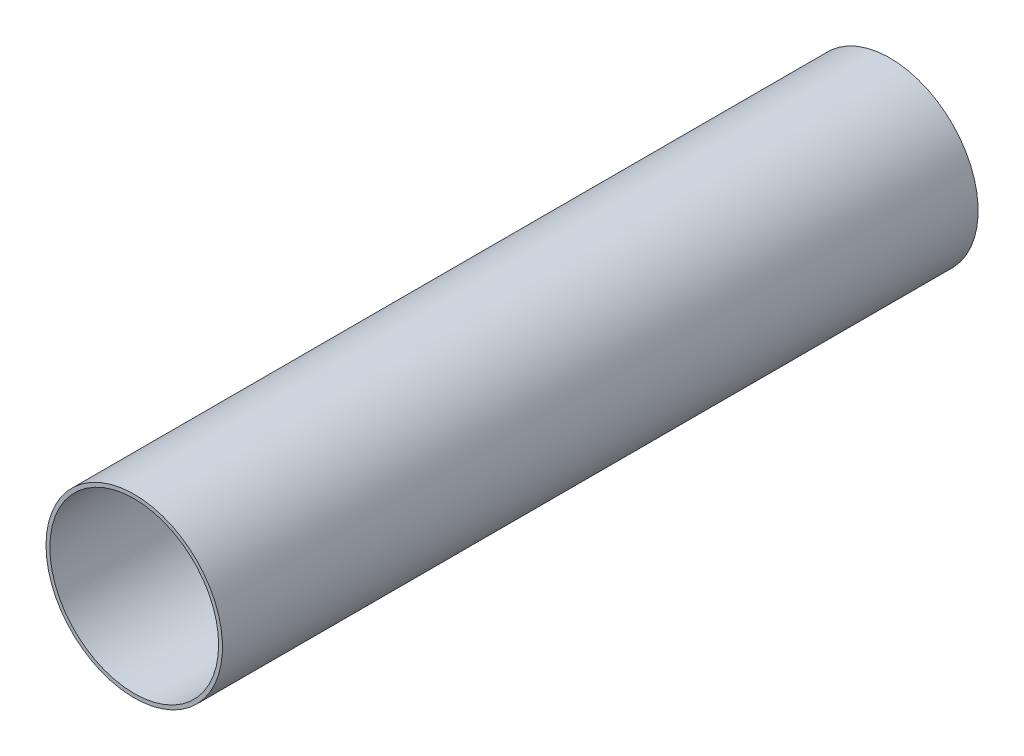
ISO-10303-21;
HEADER;
FILE_DESCRIPTION(('STEP AP214'),'2;1');
FILE_NAME('part.step','',(''),(''),'','','');
FILE_SCHEMA(('AUTOMOTIVE_DESIGN { 1 0 10303 214 1 1 1 1 }'));
ENDSEC;
DATA;
#1=APPLICATION_CONTEXT('core data for automotive mechanical design processes');
#2=APPLICATION_PROTOCOL_DEFINITION('international standard','automotive_design',2000,#1);
#3=PRODUCT_CONTEXT('',#1,'mechanical');
#4=PRODUCT('Part','Part','',(#3));
#5=PRODUCT_RELATED_PRODUCT_CATEGORY('part','',(#4));
#6=PRODUCT_DEFINITION_FORMATION('','',#4);
#7=PRODUCT_DEFINITION_CONTEXT('part definition',#1,'design');
#8=PRODUCT_DEFINITION('design','',#6,#7);
#9=PRODUCT_DEFINITION_SHAPE('','',#8);
#10=(LENGTH_UNIT() NAMED_UNIT(*) SI_UNIT(.MILLI.,.METRE.));
#11=(NAMED_UNIT(*) PLANE_ANGLE_UNIT() SI_UNIT($,.RADIAN.));
#12=(NAMED_UNIT(*) SI_UNIT($,.STERADIAN.) SOLID_ANGLE_UNIT());
#13=UNCERTAINTY_MEASURE_WITH_UNIT(LENGTH_MEASURE(1.E-05),#10,'distance_accuracy_value','');
#14=(GEOMETRIC_REPRESENTATION_CONTEXT(3) GLOBAL_UNCERTAINTY_ASSIGNED_CONTEXT((#13)) GLOBAL_UNIT_ASSIGNED_CONTEXT((#10,
#11,#12)) REPRESENTATION_CONTEXT('',''));
#15=CARTESIAN_POINT('',(0.,0.,0.));
#16=DIRECTION('',(0.,0.,1.));
#17=DIRECTION('',(1.,0.,0.));
#18=AXIS2_PLACEMENT_3D('',#15,#16,#17);
#19=CARTESIAN_POINT('',(105.000001564622,0.,0.));
#20=DIRECTION('',(0.,0.,1.));
#21=DIRECTION('',(1.,0.,0.));
#22=AXIS2_PLACEMENT_3D('',#19,#20,#21);
#23=CYLINDRICAL_SURFACE('',#22,2.2);
#24=CARTESIAN_POINT('',(105.000001564622,0.,19.7));
#25=DIRECTION('',(0.,0.,-1.));
#26=DIRECTION('',(1.,0.,0.));
#27=AXIS2_PLACEMENT_3D('',#24,#25,#26);
#28=CIRCLE('',#27,2.2);
#29=CARTESIAN_POINT('',(102.800001564622,0.,19.7));
#30=VERTEX_POINT('',#29);
#31=EDGE_CURVE('E46',#30,#30,#28,.T.);
#32=ORIENTED_EDGE('',*,*,#31,.F.);
#33=DIRECTION('',(0.,0.,-1.));
#34=VECTOR('',#33,1.);
#35=CARTESIAN_POINT('',(102.800001564622,0.,0.));
#36=LINE('',#35,#34);
#37=CARTESIAN_POINT('',(102.800001564622,0.,0.));
#38=VERTEX_POINT('',#37);
#39=EDGE_CURVE('E13',#30,#38,#36,.T.);
#40=ORIENTED_EDGE('',*,*,#39,.T.);
#41=CARTESIAN_POINT('',(105.000001564622,0.,0.));
#42=DIRECTION('',(0.,0.,-1.));
#43=DIRECTION('',(1.,0.,0.));
#44=AXIS2_PLACEMENT_3D('',#41,#42,#43);
#45=CIRCLE('',#44,2.2);
#46=EDGE_CURVE('E34',#38,#38,#45,.T.);
#47=ORIENTED_EDGE('',*,*,#46,.T.);
#48=ORIENTED_EDGE('',*,*,#39,.F.);
#49=EDGE_LOOP('',(#32,#40,#47,#48));
#50=FACE_BOUND('',#49,.T.);
#51=ADVANCED_FACE('F25',(#50),#23,.F.);
#52=CARTESIAN_POINT('',(105.000001564622,0.,0.));
#53=DIRECTION('',(0.,0.,1.));
#54=DIRECTION('',(1.,0.,0.));
#55=AXIS2_PLACEMENT_3D('',#52,#53,#54);
#56=CYLINDRICAL_SURFACE('',#55,2.3);
#57=CARTESIAN_POINT('',(105.000001564622,0.,19.7));
#58=DIRECTION('',(0.,0.,1.));
#59=DIRECTION('',(1.,0.,0.));
#60=AXIS2_PLACEMENT_3D('',#57,#58,#59);
#61=CIRCLE('',#60,2.3);
#62=CARTESIAN_POINT('',(102.700001564622,0.,19.7));
#63=VERTEX_POINT('',#62);
#64=EDGE_CURVE('E64',#63,#63,#61,.T.);
#65=ORIENTED_EDGE('',*,*,#64,.F.);
#66=DIRECTION('',(0.,0.,-1.));
#67=VECTOR('',#66,1.);
#68=CARTESIAN_POINT('',(102.700001564622,0.,0.));
#69=LINE('',#68,#67);
#70=CARTESIAN_POINT('',(102.700001564622,0.,0.));
#71=VERTEX_POINT('',#70);
#72=EDGE_CURVE('E66',#63,#71,#69,.T.);
#73=ORIENTED_EDGE('',*,*,#72,.T.);
#74=CARTESIAN_POINT('',(105.000001564622,0.,0.));
#75=DIRECTION('',(0.,0.,1.));
#76=DIRECTION('',(1.,0.,0.));
#77=AXIS2_PLACEMENT_3D('',#74,#75,#76);
#78=CIRCLE('',#77,2.3);
#79=EDGE_CURVE('E55',#71,#71,#78,.T.);
#80=ORIENTED_EDGE('',*,*,#79,.T.);
#81=ORIENTED_EDGE('',*,*,#72,.F.);
#82=EDGE_LOOP('',(#65,#73,#80,#81));
#83=FACE_BOUND('',#82,.T.);
#84=ADVANCED_FACE('F65',(#83),#56,.T.);
#85=CARTESIAN_POINT('',(105.000001564622,0.,19.7));
#86=DIRECTION('',(0.,0.,1.));
#87=DIRECTION('',(1.,0.,0.));
#88=AXIS2_PLACEMENT_3D('',#85,#86,#87);
#89=PLANE('',#88);
#90=ORIENTED_EDGE('',*,*,#64,.T.);
#91=EDGE_LOOP('',(#90));
#92=FACE_BOUND('',#91,.T.);
#93=ORIENTED_EDGE('',*,*,#31,.T.);
#94=EDGE_LOOP('',(#93));
#95=FACE_BOUND('',#94,.T.);
#96=ADVANCED_FACE('F84',(#92,#95),#89,.T.);
#97=CARTESIAN_POINT('',(105.000001564622,0.,0.));
#98=DIRECTION('',(0.,0.,1.));
#99=DIRECTION('',(1.,0.,0.));
#100=AXIS2_PLACEMENT_3D('',#97,#98,#99);
#101=PLANE('',#100);
#102=ORIENTED_EDGE('',*,*,#79,.F.);
#103=EDGE_LOOP('',(#102));
#104=FACE_BOUND('',#103,.T.);
#105=ORIENTED_EDGE('',*,*,#46,.F.);
#106=EDGE_LOOP('',(#105));
#107=FACE_BOUND('',#106,.T.);
#108=ADVANCED_FACE('F82',(#104,#107),#101,.F.);
#109=CLOSED_SHELL('',(#51,#84,#96,#108));
#110=MANIFOLD_SOLID_BREP('B1',#109);
#111=ADVANCED_BREP_SHAPE_REPRESENTATION('',(#18,#110),#14);
#112=SHAPE_DEFINITION_REPRESENTATION(#9,#111);
ENDSEC;
END-ISO-10303-21;
